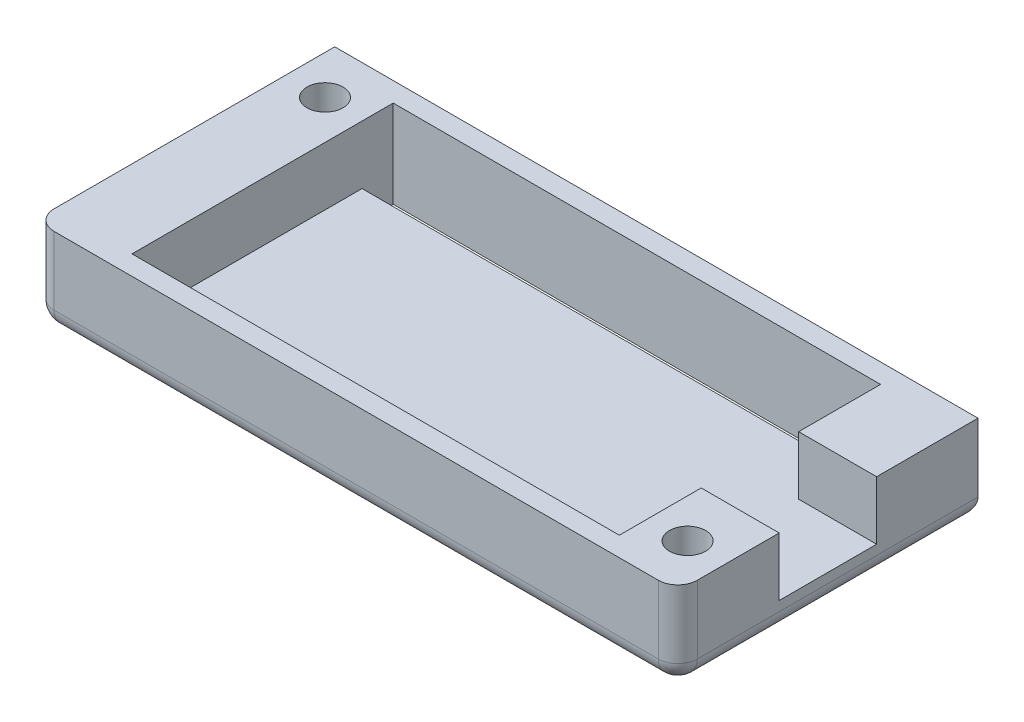
ISO-10303-21;
HEADER;
FILE_DESCRIPTION(('STEP AP214'),'2;1');
FILE_NAME('part.step','',(''),(''),'','','');
FILE_SCHEMA(('AUTOMOTIVE_DESIGN { 1 0 10303 214 1 1 1 1 }'));
ENDSEC;
DATA;
#1=APPLICATION_CONTEXT('core data for automotive mechanical design processes');
#2=APPLICATION_PROTOCOL_DEFINITION('international standard','automotive_design',2000,#1);
#3=PRODUCT_CONTEXT('',#1,'mechanical');
#4=PRODUCT('Part','Part','',(#3));
#5=PRODUCT_RELATED_PRODUCT_CATEGORY('part','',(#4));
#6=PRODUCT_DEFINITION_FORMATION('','',#4);
#7=PRODUCT_DEFINITION_CONTEXT('part definition',#1,'design');
#8=PRODUCT_DEFINITION('design','',#6,#7);
#9=PRODUCT_DEFINITION_SHAPE('','',#8);
#10=(LENGTH_UNIT() NAMED_UNIT(*) SI_UNIT(.MILLI.,.METRE.));
#11=(NAMED_UNIT(*) PLANE_ANGLE_UNIT() SI_UNIT($,.RADIAN.));
#12=(NAMED_UNIT(*) SI_UNIT($,.STERADIAN.) SOLID_ANGLE_UNIT());
#13=UNCERTAINTY_MEASURE_WITH_UNIT(LENGTH_MEASURE(1.E-05),#10,'distance_accuracy_value','');
#14=(GEOMETRIC_REPRESENTATION_CONTEXT(3) GLOBAL_UNCERTAINTY_ASSIGNED_CONTEXT((#13)) GLOBAL_UNIT_ASSIGNED_CONTEXT((#10,
#11,#12)) REPRESENTATION_CONTEXT('',''));
#15=CARTESIAN_POINT('',(0.,0.,0.));
#16=DIRECTION('',(0.,0.,1.));
#17=DIRECTION('',(1.,0.,0.));
#18=AXIS2_PLACEMENT_3D('',#15,#16,#17);
#19=CARTESIAN_POINT('',(58.,3.,-28.8));
#20=DIRECTION('',(-1.,0.,0.));
#21=DIRECTION('',(0.,0.,1.));
#22=AXIS2_PLACEMENT_3D('',#19,#20,#21);
#23=PLANE('',#22);
#24=DIRECTION('',(0.,1.,0.));
#25=VECTOR('',#24,1.);
#26=CARTESIAN_POINT('',(58.,-9.8062484748657,-10.4));
#27=LINE('',#26,#25);
#28=CARTESIAN_POINT('',(58.,3.,-10.4));
#29=VERTEX_POINT('',#28);
#30=CARTESIAN_POINT('',(58.,9.,-10.4));
#31=VERTEX_POINT('',#30);
#32=EDGE_CURVE('E218',#29,#31,#27,.T.);
#33=ORIENTED_EDGE('',*,*,#32,.F.);
#34=DIRECTION('',(0.,0.,-1.));
#35=VECTOR('',#34,1.);
#36=CARTESIAN_POINT('',(58.,3.,-28.8));
#37=LINE('',#36,#35);
#38=CARTESIAN_POINT('',(58.,3.,-5.2));
#39=VERTEX_POINT('',#38);
#40=EDGE_CURVE('E202',#39,#29,#37,.T.);
#41=ORIENTED_EDGE('',*,*,#40,.F.);
#42=DIRECTION('',(0.,-1.,0.));
#43=VECTOR('',#42,1.);
#44=CARTESIAN_POINT('',(58.,3.,-5.2));
#45=LINE('',#44,#43);
#46=CARTESIAN_POINT('',(58.,0.,-5.2));
#47=VERTEX_POINT('',#46);
#48=EDGE_CURVE('E303',#39,#47,#45,.T.);
#49=ORIENTED_EDGE('',*,*,#48,.T.);
#50=DIRECTION('',(0.,0.,-1.));
#51=VECTOR('',#50,1.);
#52=CARTESIAN_POINT('',(58.,0.,-5.2));
#53=LINE('',#52,#51);
#54=CARTESIAN_POINT('',(58.,0.,-2.));
#55=VERTEX_POINT('',#54);
#56=EDGE_CURVE('E293',#55,#47,#53,.T.);
#57=ORIENTED_EDGE('',*,*,#56,.F.);
#58=DIRECTION('',(0.,-1.,0.));
#59=VECTOR('',#58,1.);
#60=CARTESIAN_POINT('',(58.,3.,-2.));
#61=LINE('',#60,#59);
#62=CARTESIAN_POINT('',(58.,9.,-2.));
#63=VERTEX_POINT('',#62);
#64=EDGE_CURVE('E306',#63,#55,#61,.T.);
#65=ORIENTED_EDGE('',*,*,#64,.F.);
#66=DIRECTION('',(0.,0.,-1.));
#67=VECTOR('',#66,1.);
#68=CARTESIAN_POINT('',(58.,9.,-28.8));
#69=LINE('',#68,#67);
#70=EDGE_CURVE('E248',#63,#31,#69,.T.);
#71=ORIENTED_EDGE('',*,*,#70,.T.);
#72=EDGE_LOOP('',(#33,#41,#49,#57,#65,#71));
#73=FACE_BOUND('',#72,.T.);
#74=ADVANCED_FACE('F43',(#73),#23,.T.);
#75=CARTESIAN_POINT('',(0.,3.,0.));
#76=DIRECTION('',(0.,-1.,0.));
#77=DIRECTION('',(0.,0.,-1.));
#78=AXIS2_PLACEMENT_3D('',#75,#76,#77);
#79=PLANE('',#78);
#80=DIRECTION('',(1.,0.,0.));
#81=VECTOR('',#80,1.);
#82=CARTESIAN_POINT('',(8.,3.,-25.6));
#83=LINE('',#82,#81);
#84=CARTESIAN_POINT('',(8.,3.,-25.6));
#85=VERTEX_POINT('',#84);
#86=CARTESIAN_POINT('',(58.,3.,-25.6));
#87=VERTEX_POINT('',#86);
#88=EDGE_CURVE('E315',#85,#87,#83,.T.);
#89=ORIENTED_EDGE('',*,*,#88,.F.);
#90=DIRECTION('',(0.,0.,1.));
#91=VECTOR('',#90,1.);
#92=CARTESIAN_POINT('',(8.,3.,-28.8));
#93=LINE('',#92,#91);
#94=CARTESIAN_POINT('',(8.,3.,-5.2));
#95=VERTEX_POINT('',#94);
#96=EDGE_CURVE('E257',#85,#95,#93,.T.);
#97=ORIENTED_EDGE('',*,*,#96,.T.);
#98=DIRECTION('',(-1.,0.,0.));
#99=VECTOR('',#98,1.);
#100=CARTESIAN_POINT('',(8.,3.,-5.2));
#101=LINE('',#100,#99);
#102=EDGE_CURVE('E280',#39,#95,#101,.T.);
#103=ORIENTED_EDGE('',*,*,#102,.F.);
#104=ORIENTED_EDGE('',*,*,#40,.T.);
#105=DIRECTION('',(1.,0.,0.));
#106=VECTOR('',#105,1.);
#107=CARTESIAN_POINT('',(58.,3.,-10.4));
#108=LINE('',#107,#106);
#109=CARTESIAN_POINT('',(66.,3.,-10.4));
#110=VERTEX_POINT('',#109);
#111=EDGE_CURVE('E184',#29,#110,#108,.T.);
#112=ORIENTED_EDGE('',*,*,#111,.T.);
#113=DIRECTION('',(0.,0.,-1.));
#114=VECTOR('',#113,1.);
#115=CARTESIAN_POINT('',(66.,3.,-20.4));
#116=LINE('',#115,#114);
#117=CARTESIAN_POINT('',(66.,3.,-20.4));
#118=VERTEX_POINT('',#117);
#119=EDGE_CURVE('E193',#110,#118,#116,.T.);
#120=ORIENTED_EDGE('',*,*,#119,.T.);
#121=DIRECTION('',(-1.,0.,0.));
#122=VECTOR('',#121,1.);
#123=CARTESIAN_POINT('',(58.,3.,-20.4));
#124=LINE('',#123,#122);
#125=CARTESIAN_POINT('',(58.,3.,-20.4));
#126=VERTEX_POINT('',#125);
#127=EDGE_CURVE('E211',#118,#126,#124,.T.);
#128=ORIENTED_EDGE('',*,*,#127,.T.);
#129=EDGE_CURVE('E263',#126,#87,#37,.T.);
#130=ORIENTED_EDGE('',*,*,#129,.T.);
#131=EDGE_LOOP('',(#89,#97,#103,#104,#112,#120,#128,#130));
#132=FACE_BOUND('',#131,.T.);
#133=ADVANCED_FACE('F199',(#132),#79,.F.);
#134=CARTESIAN_POINT('',(0.,0.,0.));
#135=DIRECTION('',(0.,-1.,0.));
#136=DIRECTION('',(0.,0.,-1.));
#137=AXIS2_PLACEMENT_3D('',#134,#135,#136);
#138=PLANE('',#137);
#139=CARTESIAN_POINT('',(62.,0.,-5.));
#140=DIRECTION('',(0.,1.,0.));
#141=DIRECTION('',(0.,0.,1.));
#142=AXIS2_PLACEMENT_3D('',#139,#140,#141);
#143=CIRCLE('',#142,1.84999999999999);
#144=CARTESIAN_POINT('',(62.,0.,-3.15000000000001));
#145=VERTEX_POINT('',#144);
#146=EDGE_CURVE('E223',#145,#145,#143,.T.);
#147=ORIENTED_EDGE('',*,*,#146,.T.);
#148=EDGE_LOOP('',(#147));
#149=FACE_BOUND('',#148,.T.);
#150=CARTESIAN_POINT('',(4.,0.,-25.8));
#151=DIRECTION('',(0.,1.,0.));
#152=DIRECTION('',(0.,0.,1.));
#153=AXIS2_PLACEMENT_3D('',#150,#151,#152);
#154=CIRCLE('',#153,1.85);
#155=CARTESIAN_POINT('',(4.,0.,-23.95));
#156=VERTEX_POINT('',#155);
#157=EDGE_CURVE('E236',#156,#156,#154,.T.);
#158=ORIENTED_EDGE('',*,*,#157,.T.);
#159=EDGE_LOOP('',(#158));
#160=FACE_BOUND('',#159,.T.);
#161=DIRECTION('',(0.,0.,-1.));
#162=VECTOR('',#161,1.);
#163=CARTESIAN_POINT('',(58.,0.,-28.8));
#164=LINE('',#163,#162);
#165=CARTESIAN_POINT('',(58.,0.,-25.6));
#166=VERTEX_POINT('',#165);
#167=CARTESIAN_POINT('',(58.,0.,-28.8));
#168=VERTEX_POINT('',#167);
#169=EDGE_CURVE('E328',#166,#168,#164,.T.);
#170=ORIENTED_EDGE('',*,*,#169,.T.);
#171=DIRECTION('',(-1.,0.,0.));
#172=VECTOR('',#171,1.);
#173=CARTESIAN_POINT('',(66.,0.,-28.8));
#174=LINE('',#173,#172);
#175=CARTESIAN_POINT('',(64.,0.,-28.8));
#176=VERTEX_POINT('',#175);
#177=EDGE_CURVE('E374',#168,#176,#174,.F.);
#178=ORIENTED_EDGE('',*,*,#177,.T.);
#179=DIRECTION('',(0.,0.,-1.));
#180=VECTOR('',#179,1.);
#181=CARTESIAN_POINT('',(64.,0.,0.));
#182=LINE('',#181,#180);
#183=CARTESIAN_POINT('',(64.,0.,-2.));
#184=VERTEX_POINT('',#183);
#185=EDGE_CURVE('E371',#176,#184,#182,.F.);
#186=ORIENTED_EDGE('',*,*,#185,.T.);
#187=DIRECTION('',(1.,0.,0.));
#188=VECTOR('',#187,1.);
#189=CARTESIAN_POINT('',(0.,0.,-2.));
#190=LINE('',#189,#188);
#191=EDGE_CURVE('E368',#184,#55,#190,.F.);
#192=ORIENTED_EDGE('',*,*,#191,.T.);
#193=ORIENTED_EDGE('',*,*,#56,.T.);
#194=DIRECTION('',(-1.,0.,0.));
#195=VECTOR('',#194,1.);
#196=CARTESIAN_POINT('',(8.,0.,-5.2));
#197=LINE('',#196,#195);
#198=CARTESIAN_POINT('',(8.,0.,-5.2));
#199=VERTEX_POINT('',#198);
#200=EDGE_CURVE('E285',#47,#199,#197,.T.);
#201=ORIENTED_EDGE('',*,*,#200,.T.);
#202=DIRECTION('',(0.,0.,1.));
#203=VECTOR('',#202,1.);
#204=CARTESIAN_POINT('',(8.,0.,-5.2));
#205=LINE('',#204,#203);
#206=CARTESIAN_POINT('',(8.,0.,-2.));
#207=VERTEX_POINT('',#206);
#208=EDGE_CURVE('E279',#199,#207,#205,.T.);
#209=ORIENTED_EDGE('',*,*,#208,.T.);
#210=DIRECTION('',(1.,0.,0.));
#211=VECTOR('',#210,1.);
#212=CARTESIAN_POINT('',(0.,0.,-2.));
#213=LINE('',#212,#211);
#214=CARTESIAN_POINT('',(2.,0.,-2.));
#215=VERTEX_POINT('',#214);
#216=EDGE_CURVE('E358',#207,#215,#213,.F.);
#217=ORIENTED_EDGE('',*,*,#216,.T.);
#218=DIRECTION('',(0.,0.,1.));
#219=VECTOR('',#218,1.);
#220=CARTESIAN_POINT('',(2.,0.,-30.8));
#221=LINE('',#220,#219);
#222=CARTESIAN_POINT('',(2.,0.,-28.8));
#223=VERTEX_POINT('',#222);
#224=EDGE_CURVE('E361',#215,#223,#221,.F.);
#225=ORIENTED_EDGE('',*,*,#224,.T.);
#226=DIRECTION('',(-1.,0.,0.));
#227=VECTOR('',#226,1.);
#228=CARTESIAN_POINT('',(66.,0.,-28.8));
#229=LINE('',#228,#227);
#230=CARTESIAN_POINT('',(8.,0.,-28.8));
#231=VERTEX_POINT('',#230);
#232=EDGE_CURVE('E364',#223,#231,#229,.F.);
#233=ORIENTED_EDGE('',*,*,#232,.T.);
#234=DIRECTION('',(0.,0.,1.));
#235=VECTOR('',#234,1.);
#236=CARTESIAN_POINT('',(8.,0.,-28.8));
#237=LINE('',#236,#235);
#238=CARTESIAN_POINT('',(8.,0.,-25.6));
#239=VERTEX_POINT('',#238);
#240=EDGE_CURVE('E314',#231,#239,#237,.T.);
#241=ORIENTED_EDGE('',*,*,#240,.T.);
#242=DIRECTION('',(1.,0.,0.));
#243=VECTOR('',#242,1.);
#244=CARTESIAN_POINT('',(8.,0.,-25.6));
#245=LINE('',#244,#243);
#246=EDGE_CURVE('E324',#239,#166,#245,.T.);
#247=ORIENTED_EDGE('',*,*,#246,.T.);
#248=EDGE_LOOP('',(#170,#178,#186,#192,#193,#201,#209,#217,#225,#233,#241,#247));
#249=FACE_BOUND('',#248,.T.);
#250=ADVANCED_FACE('F466',(#149,#160,#249),#138,.T.);
#251=CARTESIAN_POINT('',(0.,3.,0.));
#252=DIRECTION('',(1.,0.,0.));
#253=DIRECTION('',(0.,0.,-1.));
#254=AXIS2_PLACEMENT_3D('',#251,#252,#253);
#255=PLANE('',#254);
#256=DIRECTION('',(0.,-1.,0.));
#257=VECTOR('',#256,1.);
#258=CARTESIAN_POINT('',(0.,3.,-30.8));
#259=LINE('',#258,#257);
#260=CARTESIAN_POINT('',(0.,9.,-30.8));
#261=VERTEX_POINT('',#260);
#262=CARTESIAN_POINT('',(0.,2.,-30.8));
#263=VERTEX_POINT('',#262);
#264=EDGE_CURVE('E347',#261,#263,#259,.T.);
#265=ORIENTED_EDGE('',*,*,#264,.T.);
#266=DIRECTION('',(0.,0.,1.));
#267=VECTOR('',#266,1.);
#268=CARTESIAN_POINT('',(0.,2.,0.));
#269=LINE('',#268,#267);
#270=CARTESIAN_POINT('',(0.,2.,-2.));
#271=VERTEX_POINT('',#270);
#272=EDGE_CURVE('E386',#263,#271,#269,.T.);
#273=ORIENTED_EDGE('',*,*,#272,.T.);
#274=DIRECTION('',(0.,-1.,0.));
#275=VECTOR('',#274,1.);
#276=CARTESIAN_POINT('',(0.,3.,-2.));
#277=LINE('',#276,#275);
#278=CARTESIAN_POINT('',(0.,9.,-2.00000000000001));
#279=VERTEX_POINT('',#278);
#280=EDGE_CURVE('E383',#271,#279,#277,.F.);
#281=ORIENTED_EDGE('',*,*,#280,.T.);
#282=DIRECTION('',(0.,0.,1.));
#283=VECTOR('',#282,1.);
#284=CARTESIAN_POINT('',(0.,9.,-30.8));
#285=LINE('',#284,#283);
#286=EDGE_CURVE('E256',#261,#279,#285,.T.);
#287=ORIENTED_EDGE('',*,*,#286,.F.);
#288=EDGE_LOOP('',(#265,#273,#281,#287));
#289=FACE_BOUND('',#288,.T.);
#290=ADVANCED_FACE('F449',(#289),#255,.F.);
#291=CARTESIAN_POINT('',(0.,3.,0.));
#292=DIRECTION('',(0.,0.,-1.));
#293=DIRECTION('',(-1.,0.,0.));
#294=AXIS2_PLACEMENT_3D('',#291,#292,#293);
#295=PLANE('',#294);
#296=DIRECTION('',(1.,0.,0.));
#297=VECTOR('',#296,1.);
#298=CARTESIAN_POINT('',(66.,2.,0.));
#299=LINE('',#298,#297);
#300=CARTESIAN_POINT('',(2.,2.,0.));
#301=VERTEX_POINT('',#300);
#302=CARTESIAN_POINT('',(64.,2.,0.));
#303=VERTEX_POINT('',#302);
#304=EDGE_CURVE('E69',#301,#303,#299,.T.);
#305=ORIENTED_EDGE('',*,*,#304,.T.);
#306=DIRECTION('',(0.,-1.,0.));
#307=VECTOR('',#306,1.);
#308=CARTESIAN_POINT('',(64.,3.,0.));
#309=LINE('',#308,#307);
#310=CARTESIAN_POINT('',(64.,9.,0.));
#311=VERTEX_POINT('',#310);
#312=EDGE_CURVE('E394',#303,#311,#309,.F.);
#313=ORIENTED_EDGE('',*,*,#312,.T.);
#314=DIRECTION('',(1.,0.,0.));
#315=VECTOR('',#314,1.);
#316=CARTESIAN_POINT('',(0.,9.,0.));
#317=LINE('',#316,#315);
#318=CARTESIAN_POINT('',(2.,9.,0.));
#319=VERTEX_POINT('',#318);
#320=EDGE_CURVE('E267',#319,#311,#317,.T.);
#321=ORIENTED_EDGE('',*,*,#320,.F.);
#322=DIRECTION('',(0.,-1.,0.));
#323=VECTOR('',#322,1.);
#324=CARTESIAN_POINT('',(2.,3.,0.));
#325=LINE('',#324,#323);
#326=EDGE_CURVE('E389',#319,#301,#325,.T.);
#327=ORIENTED_EDGE('',*,*,#326,.T.);
#328=EDGE_LOOP('',(#305,#313,#321,#327));
#329=FACE_BOUND('',#328,.T.);
#330=ADVANCED_FACE('F538',(#329),#295,.F.);
#331=CARTESIAN_POINT('',(66.,3.,0.));
#332=DIRECTION('',(-1.,0.,0.));
#333=DIRECTION('',(0.,0.,1.));
#334=AXIS2_PLACEMENT_3D('',#331,#332,#333);
#335=PLANE('',#334);
#336=ORIENTED_EDGE('',*,*,#119,.F.);
#337=DIRECTION('',(0.,1.,0.));
#338=VECTOR('',#337,1.);
#339=CARTESIAN_POINT('',(66.,-9.8062484748657,-10.4));
#340=LINE('',#339,#338);
#341=CARTESIAN_POINT('',(66.,9.,-10.4));
#342=VERTEX_POINT('',#341);
#343=EDGE_CURVE('E181',#110,#342,#340,.T.);
#344=ORIENTED_EDGE('',*,*,#343,.T.);
#345=DIRECTION('',(0.,0.,-1.));
#346=VECTOR('',#345,1.);
#347=CARTESIAN_POINT('',(66.,9.,-30.8));
#348=LINE('',#347,#346);
#349=CARTESIAN_POINT('',(66.,9.,-2.00000000000001));
#350=VERTEX_POINT('',#349);
#351=EDGE_CURVE('E272',#350,#342,#348,.T.);
#352=ORIENTED_EDGE('',*,*,#351,.F.);
#353=DIRECTION('',(0.,-1.,0.));
#354=VECTOR('',#353,1.);
#355=CARTESIAN_POINT('',(66.,3.,-2.));
#356=LINE('',#355,#354);
#357=CARTESIAN_POINT('',(66.,2.,-2.));
#358=VERTEX_POINT('',#357);
#359=EDGE_CURVE('E377',#350,#358,#356,.T.);
#360=ORIENTED_EDGE('',*,*,#359,.T.);
#361=DIRECTION('',(0.,0.,-1.));
#362=VECTOR('',#361,1.);
#363=CARTESIAN_POINT('',(66.,2.,-30.8));
#364=LINE('',#363,#362);
#365=CARTESIAN_POINT('',(66.,2.,-30.8));
#366=VERTEX_POINT('',#365);
#367=EDGE_CURVE('E380',#358,#366,#364,.T.);
#368=ORIENTED_EDGE('',*,*,#367,.T.);
#369=DIRECTION('',(0.,-1.,0.));
#370=VECTOR('',#369,1.);
#371=CARTESIAN_POINT('',(66.,3.,-30.8));
#372=LINE('',#371,#370);
#373=CARTESIAN_POINT('',(66.,9.,-30.8));
#374=VERTEX_POINT('',#373);
#375=EDGE_CURVE('E351',#374,#366,#372,.T.);
#376=ORIENTED_EDGE('',*,*,#375,.F.);
#377=CARTESIAN_POINT('',(66.,9.,-20.4));
#378=VERTEX_POINT('',#377);
#379=EDGE_CURVE('E271',#378,#374,#348,.T.);
#380=ORIENTED_EDGE('',*,*,#379,.F.);
#381=DIRECTION('',(0.,1.,0.));
#382=VECTOR('',#381,1.);
#383=CARTESIAN_POINT('',(66.,-9.8062484748657,-20.4));
#384=LINE('',#383,#382);
#385=EDGE_CURVE('E61',#118,#378,#384,.T.);
#386=ORIENTED_EDGE('',*,*,#385,.F.);
#387=EDGE_LOOP('',(#336,#344,#352,#360,#368,#376,#380,#386));
#388=FACE_BOUND('',#387,.T.);
#389=ADVANCED_FACE('F206',(#388),#335,.F.);
#390=CARTESIAN_POINT('',(0.,3.,-30.8));
#391=DIRECTION('',(0.,0.,1.));
#392=DIRECTION('',(1.,0.,0.));
#393=AXIS2_PLACEMENT_3D('',#390,#391,#392);
#394=PLANE('',#393);
#395=ORIENTED_EDGE('',*,*,#375,.T.);
#396=DIRECTION('',(-1.,0.,0.));
#397=VECTOR('',#396,1.);
#398=CARTESIAN_POINT('',(0.,2.,-30.8));
#399=LINE('',#398,#397);
#400=EDGE_CURVE('E260',#366,#263,#399,.T.);
#401=ORIENTED_EDGE('',*,*,#400,.T.);
#402=ORIENTED_EDGE('',*,*,#264,.F.);
#403=DIRECTION('',(-1.,0.,0.));
#404=VECTOR('',#403,1.);
#405=CARTESIAN_POINT('',(0.,9.,-30.8));
#406=LINE('',#405,#404);
#407=EDGE_CURVE('E275',#374,#261,#406,.T.);
#408=ORIENTED_EDGE('',*,*,#407,.F.);
#409=EDGE_LOOP('',(#395,#401,#402,#408));
#410=FACE_BOUND('',#409,.T.);
#411=ADVANCED_FACE('F442',(#410),#394,.F.);
#412=CARTESIAN_POINT('',(8.,3.,-28.8));
#413=DIRECTION('',(1.,0.,0.));
#414=DIRECTION('',(0.,0.,-1.));
#415=AXIS2_PLACEMENT_3D('',#412,#413,#414);
#416=PLANE('',#415);
#417=ORIENTED_EDGE('',*,*,#240,.F.);
#418=DIRECTION('',(0.,-1.,0.));
#419=VECTOR('',#418,1.);
#420=CARTESIAN_POINT('',(8.,3.,-28.8));
#421=LINE('',#420,#419);
#422=CARTESIAN_POINT('',(8.,9.,-28.8));
#423=VERTEX_POINT('',#422);
#424=EDGE_CURVE('E319',#423,#231,#421,.T.);
#425=ORIENTED_EDGE('',*,*,#424,.F.);
#426=DIRECTION('',(0.,0.,1.));
#427=VECTOR('',#426,1.);
#428=CARTESIAN_POINT('',(8.,9.,-28.8));
#429=LINE('',#428,#427);
#430=CARTESIAN_POINT('',(8.,9.,-2.));
#431=VERTEX_POINT('',#430);
#432=EDGE_CURVE('E227',#423,#431,#429,.T.);
#433=ORIENTED_EDGE('',*,*,#432,.T.);
#434=DIRECTION('',(0.,-1.,0.));
#435=VECTOR('',#434,1.);
#436=CARTESIAN_POINT('',(8.,3.,-2.));
#437=LINE('',#436,#435);
#438=EDGE_CURVE('E310',#431,#207,#437,.T.);
#439=ORIENTED_EDGE('',*,*,#438,.T.);
#440=ORIENTED_EDGE('',*,*,#208,.F.);
#441=DIRECTION('',(0.,-1.,0.));
#442=VECTOR('',#441,1.);
#443=CARTESIAN_POINT('',(8.,3.,-5.2));
#444=LINE('',#443,#442);
#445=EDGE_CURVE('E284',#95,#199,#444,.T.);
#446=ORIENTED_EDGE('',*,*,#445,.F.);
#447=ORIENTED_EDGE('',*,*,#96,.F.);
#448=DIRECTION('',(0.,-1.,0.));
#449=VECTOR('',#448,1.);
#450=CARTESIAN_POINT('',(8.,3.,-25.6));
#451=LINE('',#450,#449);
#452=EDGE_CURVE('E343',#85,#239,#451,.T.);
#453=ORIENTED_EDGE('',*,*,#452,.T.);
#454=EDGE_LOOP('',(#417,#425,#433,#439,#440,#446,#447,#453));
#455=FACE_BOUND('',#454,.T.);
#456=ADVANCED_FACE('F490',(#455),#416,.T.);
#457=CARTESIAN_POINT('',(8.,3.,-25.6));
#458=DIRECTION('',(0.,0.,-1.));
#459=DIRECTION('',(-1.,0.,0.));
#460=AXIS2_PLACEMENT_3D('',#457,#458,#459);
#461=PLANE('',#460);
#462=ORIENTED_EDGE('',*,*,#246,.F.);
#463=ORIENTED_EDGE('',*,*,#452,.F.);
#464=ORIENTED_EDGE('',*,*,#88,.T.);
#465=DIRECTION('',(0.,-1.,0.));
#466=VECTOR('',#465,1.);
#467=CARTESIAN_POINT('',(58.,3.,-25.6));
#468=LINE('',#467,#466);
#469=EDGE_CURVE('E340',#87,#166,#468,.T.);
#470=ORIENTED_EDGE('',*,*,#469,.T.);
#471=EDGE_LOOP('',(#462,#463,#464,#470));
#472=FACE_BOUND('',#471,.T.);
#473=ADVANCED_FACE('F488',(#472),#461,.T.);
#474=DIRECTION('',(0.,1.,0.));
#475=VECTOR('',#474,1.);
#476=CARTESIAN_POINT('',(58.,-9.8062484748657,-20.4));
#477=LINE('',#476,#475);
#478=CARTESIAN_POINT('',(58.,9.,-20.4));
#479=VERTEX_POINT('',#478);
#480=EDGE_CURVE('E215',#126,#479,#477,.T.);
#481=ORIENTED_EDGE('',*,*,#480,.T.);
#482=CARTESIAN_POINT('',(58.,9.,-28.8));
#483=VERTEX_POINT('',#482);
#484=EDGE_CURVE('E247',#479,#483,#69,.T.);
#485=ORIENTED_EDGE('',*,*,#484,.T.);
#486=DIRECTION('',(0.,-1.,0.));
#487=VECTOR('',#486,1.);
#488=CARTESIAN_POINT('',(58.,3.,-28.8));
#489=LINE('',#488,#487);
#490=EDGE_CURVE('E337',#483,#168,#489,.T.);
#491=ORIENTED_EDGE('',*,*,#490,.T.);
#492=ORIENTED_EDGE('',*,*,#169,.F.);
#493=ORIENTED_EDGE('',*,*,#469,.F.);
#494=ORIENTED_EDGE('',*,*,#129,.F.);
#495=EDGE_LOOP('',(#481,#485,#491,#492,#493,#494));
#496=FACE_BOUND('',#495,.T.);
#497=ADVANCED_FACE('F480',(#496),#23,.T.);
#498=CARTESIAN_POINT('',(8.,3.,-28.8));
#499=DIRECTION('',(0.,0.,1.));
#500=DIRECTION('',(1.,0.,0.));
#501=AXIS2_PLACEMENT_3D('',#498,#499,#500);
#502=PLANE('',#501);
#503=DIRECTION('',(-1.,0.,0.));
#504=VECTOR('',#503,1.);
#505=CARTESIAN_POINT('',(8.,0.,-28.8));
#506=LINE('',#505,#504);
#507=EDGE_CURVE('E320',#168,#231,#506,.T.);
#508=ORIENTED_EDGE('',*,*,#507,.F.);
#509=ORIENTED_EDGE('',*,*,#490,.F.);
#510=DIRECTION('',(-1.,0.,0.));
#511=VECTOR('',#510,1.);
#512=CARTESIAN_POINT('',(8.,9.,-28.8));
#513=LINE('',#512,#511);
#514=EDGE_CURVE('E252',#483,#423,#513,.T.);
#515=ORIENTED_EDGE('',*,*,#514,.T.);
#516=ORIENTED_EDGE('',*,*,#424,.T.);
#517=EDGE_LOOP('',(#508,#509,#515,#516));
#518=FACE_BOUND('',#517,.T.);
#519=ADVANCED_FACE('F475',(#518),#502,.T.);
#520=CARTESIAN_POINT('',(8.,3.,-2.));
#521=DIRECTION('',(0.,0.,-1.));
#522=DIRECTION('',(-1.,0.,0.));
#523=AXIS2_PLACEMENT_3D('',#520,#521,#522);
#524=PLANE('',#523);
#525=DIRECTION('',(1.,0.,0.));
#526=VECTOR('',#525,1.);
#527=CARTESIAN_POINT('',(8.,0.,-2.));
#528=LINE('',#527,#526);
#529=EDGE_CURVE('E289',#207,#55,#528,.T.);
#530=ORIENTED_EDGE('',*,*,#529,.F.);
#531=ORIENTED_EDGE('',*,*,#438,.F.);
#532=DIRECTION('',(1.,0.,0.));
#533=VECTOR('',#532,1.);
#534=CARTESIAN_POINT('',(8.,9.,-2.));
#535=LINE('',#534,#533);
#536=EDGE_CURVE('E243',#431,#63,#535,.T.);
#537=ORIENTED_EDGE('',*,*,#536,.T.);
#538=ORIENTED_EDGE('',*,*,#64,.T.);
#539=EDGE_LOOP('',(#530,#531,#537,#538));
#540=FACE_BOUND('',#539,.T.);
#541=ADVANCED_FACE('F525',(#540),#524,.T.);
#542=CARTESIAN_POINT('',(8.,3.,-5.2));
#543=DIRECTION('',(0.,0.,1.));
#544=DIRECTION('',(1.,0.,0.));
#545=AXIS2_PLACEMENT_3D('',#542,#543,#544);
#546=PLANE('',#545);
#547=ORIENTED_EDGE('',*,*,#200,.F.);
#548=ORIENTED_EDGE('',*,*,#48,.F.);
#549=ORIENTED_EDGE('',*,*,#102,.T.);
#550=ORIENTED_EDGE('',*,*,#445,.T.);
#551=EDGE_LOOP('',(#547,#548,#549,#550));
#552=FACE_BOUND('',#551,.T.);
#553=ADVANCED_FACE('F495',(#552),#546,.T.);
#554=CARTESIAN_POINT('',(0.,9.,0.));
#555=DIRECTION('',(0.,1.,0.));
#556=DIRECTION('',(0.,0.,1.));
#557=AXIS2_PLACEMENT_3D('',#554,#555,#556);
#558=PLANE('',#557);
#559=DIRECTION('',(1.,0.,0.));
#560=VECTOR('',#559,1.);
#561=CARTESIAN_POINT('',(58.,9.,-10.4));
#562=LINE('',#561,#560);
#563=EDGE_CURVE('E187',#31,#342,#562,.T.);
#564=ORIENTED_EDGE('',*,*,#563,.F.);
#565=ORIENTED_EDGE('',*,*,#70,.F.);
#566=ORIENTED_EDGE('',*,*,#536,.F.);
#567=ORIENTED_EDGE('',*,*,#432,.F.);
#568=ORIENTED_EDGE('',*,*,#514,.F.);
#569=ORIENTED_EDGE('',*,*,#484,.F.);
#570=DIRECTION('',(-1.,0.,0.));
#571=VECTOR('',#570,1.);
#572=CARTESIAN_POINT('',(58.,9.,-20.4));
#573=LINE('',#572,#571);
#574=EDGE_CURVE('E204',#378,#479,#573,.T.);
#575=ORIENTED_EDGE('',*,*,#574,.F.);
#576=ORIENTED_EDGE('',*,*,#379,.T.);
#577=ORIENTED_EDGE('',*,*,#407,.T.);
#578=ORIENTED_EDGE('',*,*,#286,.T.);
#579=CARTESIAN_POINT('',(2.,9.,-2.));
#580=DIRECTION('',(0.,1.,0.));
#581=DIRECTION('',(0.,0.,1.));
#582=AXIS2_PLACEMENT_3D('',#579,#580,#581);
#583=CIRCLE('',#582,2.);
#584=EDGE_CURVE('E53',#279,#319,#583,.T.);
#585=ORIENTED_EDGE('',*,*,#584,.T.);
#586=ORIENTED_EDGE('',*,*,#320,.T.);
#587=CARTESIAN_POINT('',(64.,9.,-2.));
#588=DIRECTION('',(0.,1.,0.));
#589=DIRECTION('',(0.,0.,1.));
#590=AXIS2_PLACEMENT_3D('',#587,#588,#589);
#591=CIRCLE('',#590,2.);
#592=EDGE_CURVE('E11',#311,#350,#591,.T.);
#593=ORIENTED_EDGE('',*,*,#592,.T.);
#594=ORIENTED_EDGE('',*,*,#351,.T.);
#595=EDGE_LOOP('',(#564,#565,#566,#567,#568,#569,#575,#576,#577,#578,#585,#586,#593,#594));
#596=FACE_BOUND('',#595,.T.);
#597=CARTESIAN_POINT('',(62.,9.,-5.));
#598=DIRECTION('',(0.,1.,0.));
#599=DIRECTION('',(0.,0.,1.));
#600=AXIS2_PLACEMENT_3D('',#597,#598,#599);
#601=CIRCLE('',#600,1.84999999999999);
#602=CARTESIAN_POINT('',(62.,9.,-3.15000000000001));
#603=VERTEX_POINT('',#602);
#604=EDGE_CURVE('E228',#603,#603,#601,.T.);
#605=ORIENTED_EDGE('',*,*,#604,.F.);
#606=EDGE_LOOP('',(#605));
#607=FACE_BOUND('',#606,.T.);
#608=CARTESIAN_POINT('',(4.,9.,-25.8));
#609=DIRECTION('',(0.,1.,0.));
#610=DIRECTION('',(0.,0.,1.));
#611=AXIS2_PLACEMENT_3D('',#608,#609,#610);
#612=CIRCLE('',#611,1.85);
#613=CARTESIAN_POINT('',(4.,9.,-23.95));
#614=VERTEX_POINT('',#613);
#615=EDGE_CURVE('E232',#614,#614,#612,.T.);
#616=ORIENTED_EDGE('',*,*,#615,.F.);
#617=EDGE_LOOP('',(#616));
#618=FACE_BOUND('',#617,.T.);
#619=ADVANCED_FACE('F445',(#596,#607,#618),#558,.T.);
#620=CARTESIAN_POINT('',(4.,0.,-25.8));
#621=DIRECTION('',(0.,1.,0.));
#622=DIRECTION('',(0.,0.,1.));
#623=AXIS2_PLACEMENT_3D('',#620,#621,#622);
#624=CYLINDRICAL_SURFACE('',#623,1.85);
#625=ORIENTED_EDGE('',*,*,#157,.F.);
#626=EDGE_LOOP('',(#625));
#627=FACE_BOUND('',#626,.T.);
#628=ORIENTED_EDGE('',*,*,#615,.T.);
#629=EDGE_LOOP('',(#628));
#630=FACE_BOUND('',#629,.T.);
#631=ADVANCED_FACE('F564',(#627,#630),#624,.F.);
#632=CARTESIAN_POINT('',(62.,0.,-5.));
#633=DIRECTION('',(0.,1.,0.));
#634=DIRECTION('',(0.,0.,1.));
#635=AXIS2_PLACEMENT_3D('',#632,#633,#634);
#636=CYLINDRICAL_SURFACE('',#635,1.84999999999999);
#637=ORIENTED_EDGE('',*,*,#146,.F.);
#638=EDGE_LOOP('',(#637));
#639=FACE_BOUND('',#638,.T.);
#640=ORIENTED_EDGE('',*,*,#604,.T.);
#641=EDGE_LOOP('',(#640));
#642=FACE_BOUND('',#641,.T.);
#643=ADVANCED_FACE('F559',(#639,#642),#636,.F.);
#644=CARTESIAN_POINT('',(64.,3.,-2.));
#645=DIRECTION('',(0.,-1.,0.));
#646=DIRECTION('',(0.,0.,-1.));
#647=AXIS2_PLACEMENT_3D('',#644,#645,#646);
#648=CYLINDRICAL_SURFACE('',#647,2.);
#649=ORIENTED_EDGE('',*,*,#592,.F.);
#650=ORIENTED_EDGE('',*,*,#312,.F.);
#651=CARTESIAN_POINT('',(64.,2.,-2.));
#652=DIRECTION('',(0.,-1.,0.));
#653=DIRECTION('',(0.,0.,-1.));
#654=AXIS2_PLACEMENT_3D('',#651,#652,#653);
#655=CIRCLE('',#654,2.);
#656=EDGE_CURVE('E420',#358,#303,#655,.T.);
#657=ORIENTED_EDGE('',*,*,#656,.F.);
#658=ORIENTED_EDGE('',*,*,#359,.F.);
#659=EDGE_LOOP('',(#649,#650,#657,#658));
#660=FACE_BOUND('',#659,.T.);
#661=ADVANCED_FACE('F45',(#660),#648,.T.);
#662=CARTESIAN_POINT('',(2.,3.,-2.));
#663=DIRECTION('',(0.,-1.,0.));
#664=DIRECTION('',(0.,0.,-1.));
#665=AXIS2_PLACEMENT_3D('',#662,#663,#664);
#666=CYLINDRICAL_SURFACE('',#665,2.);
#667=ORIENTED_EDGE('',*,*,#584,.F.);
#668=ORIENTED_EDGE('',*,*,#280,.F.);
#669=CARTESIAN_POINT('',(2.,2.,-2.));
#670=DIRECTION('',(0.,-1.,0.));
#671=DIRECTION('',(0.,0.,-1.));
#672=AXIS2_PLACEMENT_3D('',#669,#670,#671);
#673=CIRCLE('',#672,2.);
#674=EDGE_CURVE('E417',#301,#271,#673,.T.);
#675=ORIENTED_EDGE('',*,*,#674,.F.);
#676=ORIENTED_EDGE('',*,*,#326,.F.);
#677=EDGE_LOOP('',(#667,#668,#675,#676));
#678=FACE_BOUND('',#677,.T.);
#679=ADVANCED_FACE('F454',(#678),#666,.T.);
#680=CARTESIAN_POINT('',(0.,2.,-2.));
#681=DIRECTION('',(-1.,0.,0.));
#682=DIRECTION('',(0.,0.,1.));
#683=AXIS2_PLACEMENT_3D('',#680,#681,#682);
#684=CYLINDRICAL_SURFACE('',#683,2.);
#685=CARTESIAN_POINT('',(64.,2.,-2.));
#686=DIRECTION('',(1.,0.,0.));
#687=DIRECTION('',(0.,0.,-1.));
#688=AXIS2_PLACEMENT_3D('',#685,#686,#687);
#689=CIRCLE('',#688,2.);
#690=EDGE_CURVE('E47',#303,#184,#689,.T.);
#691=ORIENTED_EDGE('',*,*,#690,.F.);
#692=ORIENTED_EDGE('',*,*,#304,.F.);
#693=CARTESIAN_POINT('',(2.,2.,-2.));
#694=DIRECTION('',(-1.,0.,0.));
#695=DIRECTION('',(0.,0.,1.));
#696=AXIS2_PLACEMENT_3D('',#693,#694,#695);
#697=CIRCLE('',#696,2.);
#698=EDGE_CURVE('E413',#215,#301,#697,.T.);
#699=ORIENTED_EDGE('',*,*,#698,.F.);
#700=ORIENTED_EDGE('',*,*,#216,.F.);
#701=ORIENTED_EDGE('',*,*,#529,.T.);
#702=ORIENTED_EDGE('',*,*,#191,.F.);
#703=EDGE_LOOP('',(#691,#692,#699,#700,#701,#702));
#704=FACE_BOUND('',#703,.T.);
#705=ADVANCED_FACE('F553',(#704),#684,.T.);
#706=CARTESIAN_POINT('',(64.,2.,-2.));
#707=DIRECTION('',(0.,0.,1.));
#708=DIRECTION('',(1.,0.,0.));
#709=AXIS2_PLACEMENT_3D('',#706,#707,#708);
#710=SPHERICAL_SURFACE('',#709,2.);
#711=ORIENTED_EDGE('',*,*,#656,.T.);
#712=ORIENTED_EDGE('',*,*,#690,.T.);
#713=CARTESIAN_POINT('',(64.,2.,-2.));
#714=DIRECTION('',(0.,0.,1.));
#715=DIRECTION('',(1.,0.,0.));
#716=AXIS2_PLACEMENT_3D('',#713,#714,#715);
#717=CIRCLE('',#716,2.);
#718=EDGE_CURVE('E409',#358,#184,#717,.F.);
#719=ORIENTED_EDGE('',*,*,#718,.F.);
#720=EDGE_LOOP('',(#711,#712,#719));
#721=FACE_BOUND('',#720,.T.);
#722=ADVANCED_FACE('F429',(#721),#710,.T.);
#723=CARTESIAN_POINT('',(2.,2.,-2.));
#724=DIRECTION('',(0.,0.,1.));
#725=DIRECTION('',(1.,0.,0.));
#726=AXIS2_PLACEMENT_3D('',#723,#724,#725);
#727=SPHERICAL_SURFACE('',#726,2.);
#728=ORIENTED_EDGE('',*,*,#698,.T.);
#729=ORIENTED_EDGE('',*,*,#674,.T.);
#730=CARTESIAN_POINT('',(2.,2.,-2.));
#731=DIRECTION('',(0.,0.,1.));
#732=DIRECTION('',(1.,0.,0.));
#733=AXIS2_PLACEMENT_3D('',#730,#731,#732);
#734=CIRCLE('',#733,2.);
#735=EDGE_CURVE('E405',#215,#271,#734,.F.);
#736=ORIENTED_EDGE('',*,*,#735,.F.);
#737=EDGE_LOOP('',(#728,#729,#736));
#738=FACE_BOUND('',#737,.T.);
#739=ADVANCED_FACE('F458',(#738),#727,.T.);
#740=CARTESIAN_POINT('',(64.,2.,0.));
#741=DIRECTION('',(0.,0.,1.));
#742=DIRECTION('',(1.,0.,0.));
#743=AXIS2_PLACEMENT_3D('',#740,#741,#742);
#744=CYLINDRICAL_SURFACE('',#743,2.);
#745=ORIENTED_EDGE('',*,*,#718,.T.);
#746=ORIENTED_EDGE('',*,*,#185,.F.);
#747=CARTESIAN_POINT('',(64.,2.,-28.8));
#748=DIRECTION('',(0.707106781186547,0.,0.707106781186547));
#749=DIRECTION('',(-0.707106781186547,0.,0.707106781186547));
#750=AXIS2_PLACEMENT_3D('',#747,#748,#749);
#751=ELLIPSE('',#750,2.82842712474619,2.);
#752=EDGE_CURVE('E401',#366,#176,#751,.F.);
#753=ORIENTED_EDGE('',*,*,#752,.F.);
#754=ORIENTED_EDGE('',*,*,#367,.F.);
#755=EDGE_LOOP('',(#745,#746,#753,#754));
#756=FACE_BOUND('',#755,.T.);
#757=ADVANCED_FACE('F435',(#756),#744,.T.);
#758=CARTESIAN_POINT('',(2.,2.,0.));
#759=DIRECTION('',(0.,0.,-1.));
#760=DIRECTION('',(-1.,0.,0.));
#761=AXIS2_PLACEMENT_3D('',#758,#759,#760);
#762=CYLINDRICAL_SURFACE('',#761,2.);
#763=ORIENTED_EDGE('',*,*,#735,.T.);
#764=ORIENTED_EDGE('',*,*,#272,.F.);
#765=CARTESIAN_POINT('',(2.,2.,-28.8));
#766=DIRECTION('',(0.707106781186547,0.,-0.707106781186547));
#767=DIRECTION('',(-0.707106781186547,0.,-0.707106781186547));
#768=AXIS2_PLACEMENT_3D('',#765,#766,#767);
#769=ELLIPSE('',#768,2.82842712474619,2.);
#770=EDGE_CURVE('E222',#223,#263,#769,.T.);
#771=ORIENTED_EDGE('',*,*,#770,.F.);
#772=ORIENTED_EDGE('',*,*,#224,.F.);
#773=EDGE_LOOP('',(#763,#764,#771,#772));
#774=FACE_BOUND('',#773,.T.);
#775=ADVANCED_FACE('F462',(#774),#762,.T.);
#776=CARTESIAN_POINT('',(0.,2.,-28.8));
#777=DIRECTION('',(1.,0.,0.));
#778=DIRECTION('',(0.,0.,-1.));
#779=AXIS2_PLACEMENT_3D('',#776,#777,#778);
#780=CYLINDRICAL_SURFACE('',#779,2.);
#781=ORIENTED_EDGE('',*,*,#507,.T.);
#782=ORIENTED_EDGE('',*,*,#232,.F.);
#783=ORIENTED_EDGE('',*,*,#770,.T.);
#784=ORIENTED_EDGE('',*,*,#400,.F.);
#785=ORIENTED_EDGE('',*,*,#752,.T.);
#786=ORIENTED_EDGE('',*,*,#177,.F.);
#787=EDGE_LOOP('',(#781,#782,#783,#784,#785,#786));
#788=FACE_BOUND('',#787,.T.);
#789=ADVANCED_FACE('F470',(#788),#780,.T.);
#790=CARTESIAN_POINT('',(58.,-9.8062484748657,-10.4));
#791=DIRECTION('',(0.,0.,1.));
#792=DIRECTION('',(1.,0.,0.));
#793=AXIS2_PLACEMENT_3D('',#790,#791,#792);
#794=PLANE('',#793);
#795=ORIENTED_EDGE('',*,*,#32,.T.);
#796=ORIENTED_EDGE('',*,*,#563,.T.);
#797=ORIENTED_EDGE('',*,*,#343,.F.);
#798=ORIENTED_EDGE('',*,*,#111,.F.);
#799=EDGE_LOOP('',(#795,#796,#797,#798));
#800=FACE_BOUND('',#799,.T.);
#801=ADVANCED_FACE('F183',(#800),#794,.F.);
#802=CARTESIAN_POINT('',(58.,-9.8062484748657,-20.4));
#803=DIRECTION('',(0.,0.,-1.));
#804=DIRECTION('',(-1.,0.,0.));
#805=AXIS2_PLACEMENT_3D('',#802,#803,#804);
#806=PLANE('',#805);
#807=ORIENTED_EDGE('',*,*,#385,.T.);
#808=ORIENTED_EDGE('',*,*,#574,.T.);
#809=ORIENTED_EDGE('',*,*,#480,.F.);
#810=ORIENTED_EDGE('',*,*,#127,.F.);
#811=EDGE_LOOP('',(#807,#808,#809,#810));
#812=FACE_BOUND('',#811,.T.);
#813=ADVANCED_FACE('F504',(#812),#806,.F.);
#814=CLOSED_SHELL('',(#74,#133,#250,#290,#330,#389,#411,#456,#473,#497,#519,#541,#553,#619,#631,
#643,#661,#679,#705,#722,#739,#757,#775,#789,#801,#813));
#815=MANIFOLD_SOLID_BREP('B2',#814);
#816=ADVANCED_BREP_SHAPE_REPRESENTATION('',(#18,#815),#14);
#817=SHAPE_DEFINITION_REPRESENTATION(#9,#816);
ENDSEC;
END-ISO-10303-21;
